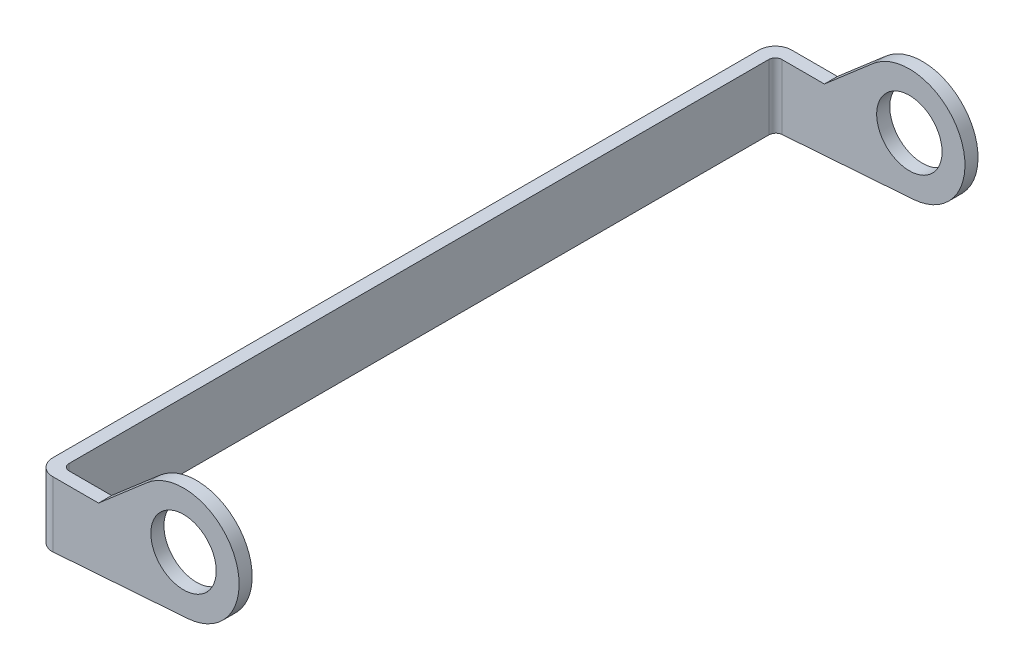
ISO-10303-21;
HEADER;
FILE_DESCRIPTION(('STEP AP214'),'2;1');
FILE_NAME('part.step','',(''),(''),'','','');
FILE_SCHEMA(('AUTOMOTIVE_DESIGN { 1 0 10303 214 1 1 1 1 }'));
ENDSEC;
DATA;
#1=APPLICATION_CONTEXT('core data for automotive mechanical design processes');
#2=APPLICATION_PROTOCOL_DEFINITION('international standard','automotive_design',2000,#1);
#3=PRODUCT_CONTEXT('',#1,'mechanical');
#4=PRODUCT('Part','Part','',(#3));
#5=PRODUCT_RELATED_PRODUCT_CATEGORY('part','',(#4));
#6=PRODUCT_DEFINITION_FORMATION('','',#4);
#7=PRODUCT_DEFINITION_CONTEXT('part definition',#1,'design');
#8=PRODUCT_DEFINITION('design','',#6,#7);
#9=PRODUCT_DEFINITION_SHAPE('','',#8);
#10=(LENGTH_UNIT() NAMED_UNIT(*) SI_UNIT(.MILLI.,.METRE.));
#11=(NAMED_UNIT(*) PLANE_ANGLE_UNIT() SI_UNIT($,.RADIAN.));
#12=(NAMED_UNIT(*) SI_UNIT($,.STERADIAN.) SOLID_ANGLE_UNIT());
#13=UNCERTAINTY_MEASURE_WITH_UNIT(LENGTH_MEASURE(1.E-05),#10,'distance_accuracy_value','');
#14=(GEOMETRIC_REPRESENTATION_CONTEXT(3) GLOBAL_UNCERTAINTY_ASSIGNED_CONTEXT((#13)) GLOBAL_UNIT_ASSIGNED_CONTEXT((#10,
#11,#12)) REPRESENTATION_CONTEXT('',''));
#15=CARTESIAN_POINT('',(0.,0.,0.));
#16=DIRECTION('',(0.,0.,1.));
#17=DIRECTION('',(1.,0.,0.));
#18=AXIS2_PLACEMENT_3D('',#15,#16,#17);
#19=CARTESIAN_POINT('',(0.,0.,4.));
#20=DIRECTION('',(0.,0.,1.));
#21=DIRECTION('',(1.,0.,0.));
#22=AXIS2_PLACEMENT_3D('',#19,#20,#21);
#23=PLANE('',#22);
#24=DIRECTION('',(-1.,0.,0.));
#25=VECTOR('',#24,1.);
#26=CARTESIAN_POINT('',(-26.,0.,3.99999999999999));
#27=LINE('',#26,#25);
#28=CARTESIAN_POINT('',(-26.,0.,3.99999999999999));
#29=VERTEX_POINT('',#28);
#30=CARTESIAN_POINT('',(-40.,0.,3.99999999999998));
#31=VERTEX_POINT('',#30);
#32=EDGE_CURVE('E223',#29,#31,#27,.T.);
#33=ORIENTED_EDGE('',*,*,#32,.T.);
#34=DIRECTION('',(0.,-1.,0.));
#35=VECTOR('',#34,1.);
#36=CARTESIAN_POINT('',(-40.,-20.,3.99999999999998));
#37=LINE('',#36,#35);
#38=CARTESIAN_POINT('',(-40.,-19.9279054285989,3.99999999999998));
#39=VERTEX_POINT('',#38);
#40=EDGE_CURVE('E297',#31,#39,#37,.T.);
#41=ORIENTED_EDGE('',*,*,#40,.T.);
#42=DIRECTION('',(0.997411273454287,0.0719079382703841,0.));
#43=VECTOR('',#42,1.);
#44=CARTESIAN_POINT('',(-41.,-20.,3.99999999999998));
#45=LINE('',#44,#43);
#46=CARTESIAN_POINT('',(1.22243495059653,-16.9559916487229,3.99999999999992));
#47=VERTEX_POINT('',#46);
#48=EDGE_CURVE('E227',#39,#47,#45,.T.);
#49=ORIENTED_EDGE('',*,*,#48,.T.);
#50=CARTESIAN_POINT('',(0.,0.,4.));
#51=DIRECTION('',(0.,0.,1.));
#52=DIRECTION('',(1.,0.,0.));
#53=AXIS2_PLACEMENT_3D('',#50,#51,#52);
#54=CIRCLE('',#53,17.);
#55=CARTESIAN_POINT('',(-11.1153846153846,12.8626678745924,4.));
#56=VERTEX_POINT('',#55);
#57=EDGE_CURVE('E231',#47,#56,#54,.T.);
#58=ORIENTED_EDGE('',*,*,#57,.T.);
#59=DIRECTION('',(-0.756627522034846,-0.653846153846154,0.));
#60=VECTOR('',#59,1.);
#61=CARTESIAN_POINT('',(-26.,0.,3.99999999999999));
#62=LINE('',#61,#60);
#63=EDGE_CURVE('E234',#56,#29,#62,.T.);
#64=ORIENTED_EDGE('',*,*,#63,.T.);
#65=EDGE_LOOP('',(#33,#41,#49,#58,#64));
#66=FACE_BOUND('',#65,.T.);
#67=CARTESIAN_POINT('',(0.,0.,4.));
#68=DIRECTION('',(0.,0.,1.));
#69=DIRECTION('',(1.,0.,0.));
#70=AXIS2_PLACEMENT_3D('',#67,#68,#69);
#71=CIRCLE('',#70,10.);
#72=CARTESIAN_POINT('',(10.,0.,4.));
#73=VERTEX_POINT('',#72);
#74=EDGE_CURVE('E215',#73,#73,#71,.T.);
#75=ORIENTED_EDGE('',*,*,#74,.F.);
#76=EDGE_LOOP('',(#75));
#77=FACE_BOUND('',#76,.T.);
#78=ADVANCED_FACE('F47',(#66,#77),#23,.T.);
#79=CARTESIAN_POINT('',(0.,0.,0.));
#80=DIRECTION('',(0.,0.,1.));
#81=DIRECTION('',(1.,0.,0.));
#82=AXIS2_PLACEMENT_3D('',#79,#80,#81);
#83=PLANE('',#82);
#84=DIRECTION('',(0.997411273454287,0.0719079382703841,0.));
#85=VECTOR('',#84,1.);
#86=CARTESIAN_POINT('',(-41.,-20.,0.));
#87=LINE('',#86,#85);
#88=CARTESIAN_POINT('',(-39.,-19.8558108571977,0.));
#89=VERTEX_POINT('',#88);
#90=CARTESIAN_POINT('',(1.22243495059653,-16.9559916487229,0.));
#91=VERTEX_POINT('',#90);
#92=EDGE_CURVE('E241',#89,#91,#87,.T.);
#93=ORIENTED_EDGE('',*,*,#92,.F.);
#94=DIRECTION('',(0.,1.,0.));
#95=VECTOR('',#94,1.);
#96=CARTESIAN_POINT('',(-39.,0.,0.));
#97=LINE('',#96,#95);
#98=CARTESIAN_POINT('',(-39.,0.,0.));
#99=VERTEX_POINT('',#98);
#100=EDGE_CURVE('E313',#89,#99,#97,.T.);
#101=ORIENTED_EDGE('',*,*,#100,.T.);
#102=DIRECTION('',(-1.,0.,0.));
#103=VECTOR('',#102,1.);
#104=CARTESIAN_POINT('',(-26.,0.,0.));
#105=LINE('',#104,#103);
#106=CARTESIAN_POINT('',(-26.,0.,0.));
#107=VERTEX_POINT('',#106);
#108=EDGE_CURVE('E219',#107,#99,#105,.T.);
#109=ORIENTED_EDGE('',*,*,#108,.F.);
#110=DIRECTION('',(-0.756627522034846,-0.653846153846154,0.));
#111=VECTOR('',#110,1.);
#112=CARTESIAN_POINT('',(-26.,0.,0.));
#113=LINE('',#112,#111);
#114=CARTESIAN_POINT('',(-11.1153846153846,12.8626678745924,0.));
#115=VERTEX_POINT('',#114);
#116=EDGE_CURVE('E228',#115,#107,#113,.T.);
#117=ORIENTED_EDGE('',*,*,#116,.F.);
#118=CARTESIAN_POINT('',(0.,0.,0.));
#119=DIRECTION('',(0.,0.,1.));
#120=DIRECTION('',(1.,0.,0.));
#121=AXIS2_PLACEMENT_3D('',#118,#119,#120);
#122=CIRCLE('',#121,17.);
#123=EDGE_CURVE('E244',#91,#115,#122,.T.);
#124=ORIENTED_EDGE('',*,*,#123,.F.);
#125=EDGE_LOOP('',(#93,#101,#109,#117,#124));
#126=FACE_BOUND('',#125,.T.);
#127=CARTESIAN_POINT('',(0.,0.,0.));
#128=DIRECTION('',(0.,0.,1.));
#129=DIRECTION('',(1.,0.,0.));
#130=AXIS2_PLACEMENT_3D('',#127,#128,#129);
#131=CIRCLE('',#130,10.);
#132=CARTESIAN_POINT('',(10.,0.,0.));
#133=VERTEX_POINT('',#132);
#134=EDGE_CURVE('E212',#133,#133,#131,.T.);
#135=ORIENTED_EDGE('',*,*,#134,.T.);
#136=EDGE_LOOP('',(#135));
#137=FACE_BOUND('',#136,.T.);
#138=ADVANCED_FACE('F345',(#126,#137),#83,.F.);
#139=CARTESIAN_POINT('',(-26.,0.,3.99999999999999));
#140=DIRECTION('',(0.,-1.,0.));
#141=DIRECTION('',(1.,0.,0.));
#142=AXIS2_PLACEMENT_3D('',#139,#140,#141);
#143=PLANE('',#142);
#144=DIRECTION('',(-1.,0.,0.));
#145=VECTOR('',#144,1.);
#146=CARTESIAN_POINT('',(-45.,0.,-222.));
#147=LINE('',#146,#145);
#148=CARTESIAN_POINT('',(-25.9999999999999,0.,-222.));
#149=VERTEX_POINT('',#148);
#150=CARTESIAN_POINT('',(-40.,0.,-222.));
#151=VERTEX_POINT('',#150);
#152=EDGE_CURVE('E173',#149,#151,#147,.T.);
#153=ORIENTED_EDGE('',*,*,#152,.T.);
#154=CARTESIAN_POINT('',(-40.,0.,-217.));
#155=DIRECTION('',(0.,-1.,0.));
#156=DIRECTION('',(1.,0.,0.));
#157=AXIS2_PLACEMENT_3D('',#154,#155,#156);
#158=CIRCLE('',#157,5.);
#159=CARTESIAN_POINT('',(-45.,0.,-217.));
#160=VERTEX_POINT('',#159);
#161=EDGE_CURVE('E294',#151,#160,#158,.F.);
#162=ORIENTED_EDGE('',*,*,#161,.T.);
#163=DIRECTION('',(0.,0.,-1.));
#164=VECTOR('',#163,1.);
#165=CARTESIAN_POINT('',(-45.,0.,3.99999999999992));
#166=LINE('',#165,#164);
#167=CARTESIAN_POINT('',(-45.,0.,-1.00000000000007));
#168=VERTEX_POINT('',#167);
#169=EDGE_CURVE('E268',#168,#160,#166,.T.);
#170=ORIENTED_EDGE('',*,*,#169,.F.);
#171=CARTESIAN_POINT('',(-40.,0.,-1.));
#172=DIRECTION('',(0.,-1.,0.));
#173=DIRECTION('',(1.,0.,0.));
#174=AXIS2_PLACEMENT_3D('',#171,#172,#173);
#175=CIRCLE('',#174,5.);
#176=EDGE_CURVE('E291',#168,#31,#175,.F.);
#177=ORIENTED_EDGE('',*,*,#176,.T.);
#178=ORIENTED_EDGE('',*,*,#32,.F.);
#179=DIRECTION('',(0.,0.,-1.));
#180=VECTOR('',#179,1.);
#181=CARTESIAN_POINT('',(-26.,0.,3.99999999999999));
#182=LINE('',#181,#180);
#183=EDGE_CURVE('E237',#29,#107,#182,.T.);
#184=ORIENTED_EDGE('',*,*,#183,.T.);
#185=ORIENTED_EDGE('',*,*,#108,.T.);
#186=CARTESIAN_POINT('',(-39.,0.,-2.));
#187=DIRECTION('',(0.,-1.,0.));
#188=DIRECTION('',(1.,0.,0.));
#189=AXIS2_PLACEMENT_3D('',#186,#187,#188);
#190=CIRCLE('',#189,2.);
#191=CARTESIAN_POINT('',(-41.,0.,-2.));
#192=VERTEX_POINT('',#191);
#193=EDGE_CURVE('E57',#99,#192,#190,.T.);
#194=ORIENTED_EDGE('',*,*,#193,.T.);
#195=DIRECTION('',(0.,0.,1.));
#196=VECTOR('',#195,1.);
#197=CARTESIAN_POINT('',(-41.,0.,-222.));
#198=LINE('',#197,#196);
#199=CARTESIAN_POINT('',(-41.,0.,-216.));
#200=VERTEX_POINT('',#199);
#201=EDGE_CURVE('E208',#200,#192,#198,.T.);
#202=ORIENTED_EDGE('',*,*,#201,.F.);
#203=CARTESIAN_POINT('',(-39.,0.,-216.));
#204=DIRECTION('',(0.,-1.,0.));
#205=DIRECTION('',(1.,0.,0.));
#206=AXIS2_PLACEMENT_3D('',#203,#204,#205);
#207=CIRCLE('',#206,2.);
#208=CARTESIAN_POINT('',(-39.,0.,-218.));
#209=VERTEX_POINT('',#208);
#210=EDGE_CURVE('E320',#200,#209,#207,.T.);
#211=ORIENTED_EDGE('',*,*,#210,.T.);
#212=DIRECTION('',(-1.,0.,0.));
#213=VECTOR('',#212,1.);
#214=CARTESIAN_POINT('',(-25.9999999999999,0.,-218.));
#215=LINE('',#214,#213);
#216=CARTESIAN_POINT('',(-25.9999999999999,0.,-218.));
#217=VERTEX_POINT('',#216);
#218=EDGE_CURVE('E163',#217,#209,#215,.T.);
#219=ORIENTED_EDGE('',*,*,#218,.F.);
#220=DIRECTION('',(0.,0.,-1.));
#221=VECTOR('',#220,1.);
#222=CARTESIAN_POINT('',(-25.9999999999999,0.,-218.));
#223=LINE('',#222,#221);
#224=EDGE_CURVE('E185',#217,#149,#223,.T.);
#225=ORIENTED_EDGE('',*,*,#224,.T.);
#226=EDGE_LOOP('',(#153,#162,#170,#177,#178,#184,#185,#194,#202,#211,#219,#225));
#227=FACE_BOUND('',#226,.T.);
#228=ADVANCED_FACE('F327',(#227),#143,.F.);
#229=CARTESIAN_POINT('',(-45.,0.,3.99999999999992));
#230=DIRECTION('',(1.,0.,0.));
#231=DIRECTION('',(0.,0.,-1.));
#232=AXIS2_PLACEMENT_3D('',#229,#230,#231);
#233=PLANE('',#232);
#234=ORIENTED_EDGE('',*,*,#169,.T.);
#235=DIRECTION('',(0.,-1.,0.));
#236=VECTOR('',#235,1.);
#237=CARTESIAN_POINT('',(-45.,0.,-217.));
#238=LINE('',#237,#236);
#239=CARTESIAN_POINT('',(-45.,-20.,-217.));
#240=VERTEX_POINT('',#239);
#241=EDGE_CURVE('E275',#160,#240,#238,.T.);
#242=ORIENTED_EDGE('',*,*,#241,.T.);
#243=DIRECTION('',(0.,0.,-1.));
#244=VECTOR('',#243,1.);
#245=CARTESIAN_POINT('',(-45.,-20.,3.99999999999992));
#246=LINE('',#245,#244);
#247=CARTESIAN_POINT('',(-45.,-20.,-1.00000000000007));
#248=VERTEX_POINT('',#247);
#249=EDGE_CURVE('E264',#248,#240,#246,.T.);
#250=ORIENTED_EDGE('',*,*,#249,.F.);
#251=DIRECTION('',(0.,-1.,0.));
#252=VECTOR('',#251,1.);
#253=CARTESIAN_POINT('',(-45.,0.,-1.00000000000007));
#254=LINE('',#253,#252);
#255=EDGE_CURVE('E272',#248,#168,#254,.F.);
#256=ORIENTED_EDGE('',*,*,#255,.T.);
#257=EDGE_LOOP('',(#234,#242,#250,#256));
#258=FACE_BOUND('',#257,.T.);
#259=ADVANCED_FACE('F369',(#258),#233,.F.);
#260=CARTESIAN_POINT('',(-45.,-20.,3.99999999999992));
#261=DIRECTION('',(0.,1.,0.));
#262=DIRECTION('',(0.,0.,1.));
#263=AXIS2_PLACEMENT_3D('',#260,#261,#262);
#264=PLANE('',#263);
#265=ORIENTED_EDGE('',*,*,#249,.T.);
#266=CARTESIAN_POINT('',(-40.,-20.,-217.));
#267=DIRECTION('',(0.,1.,0.));
#268=DIRECTION('',(0.,0.,1.));
#269=AXIS2_PLACEMENT_3D('',#266,#267,#268);
#270=CIRCLE('',#269,5.);
#271=CARTESIAN_POINT('',(-41.,-20.,-221.898979485566));
#272=VERTEX_POINT('',#271);
#273=EDGE_CURVE('E282',#240,#272,#270,.F.);
#274=ORIENTED_EDGE('',*,*,#273,.T.);
#275=DIRECTION('',(0.,0.,1.));
#276=VECTOR('',#275,1.);
#277=CARTESIAN_POINT('',(-41.,-20.,-222.));
#278=LINE('',#277,#276);
#279=CARTESIAN_POINT('',(-41.,-20.,-216.));
#280=VERTEX_POINT('',#279);
#281=EDGE_CURVE('E64',#272,#280,#278,.T.);
#282=ORIENTED_EDGE('',*,*,#281,.T.);
#283=CARTESIAN_POINT('',(-41.,-20.,-2.));
#284=VERTEX_POINT('',#283);
#285=EDGE_CURVE('E207',#280,#284,#278,.T.);
#286=ORIENTED_EDGE('',*,*,#285,.T.);
#287=DIRECTION('',(0.,0.,-1.));
#288=VECTOR('',#287,1.);
#289=CARTESIAN_POINT('',(-41.,-20.,3.99999999999998));
#290=LINE('',#289,#288);
#291=CARTESIAN_POINT('',(-41.,-20.,3.89897948556633));
#292=VERTEX_POINT('',#291);
#293=EDGE_CURVE('E260',#292,#284,#290,.T.);
#294=ORIENTED_EDGE('',*,*,#293,.F.);
#295=CARTESIAN_POINT('',(-40.,-20.,-1.));
#296=DIRECTION('',(0.,1.,0.));
#297=DIRECTION('',(0.,0.,1.));
#298=AXIS2_PLACEMENT_3D('',#295,#296,#297);
#299=CIRCLE('',#298,5.);
#300=EDGE_CURVE('E279',#292,#248,#299,.F.);
#301=ORIENTED_EDGE('',*,*,#300,.T.);
#302=EDGE_LOOP('',(#265,#274,#282,#286,#294,#301));
#303=FACE_BOUND('',#302,.T.);
#304=ADVANCED_FACE('F362',(#303),#264,.F.);
#305=CARTESIAN_POINT('',(-41.,-20.,3.99999999999998));
#306=DIRECTION('',(-0.0719079382703841,0.997411273454287,0.));
#307=DIRECTION('',(-0.997411273454287,-0.0719079382703841,0.));
#308=AXIS2_PLACEMENT_3D('',#305,#306,#307);
#309=PLANE('',#308);
#310=ORIENTED_EDGE('',*,*,#48,.F.);
#311=CARTESIAN_POINT('',(-40.,-19.9279054285989,-1.));
#312=DIRECTION('',(-0.0719079382703841,0.997411273454287,0.));
#313=DIRECTION('',(0.997411273454287,0.0719079382703841,0.));
#314=AXIS2_PLACEMENT_3D('',#311,#312,#313);
#315=ELLIPSE('',#314,5.01297722722116,5.);
#316=EDGE_CURVE('E301',#39,#292,#315,.F.);
#317=ORIENTED_EDGE('',*,*,#316,.T.);
#318=ORIENTED_EDGE('',*,*,#293,.T.);
#319=CARTESIAN_POINT('',(-39.,-19.8558108571977,-2.));
#320=DIRECTION('',(-0.0719079382703841,0.997411273454287,0.));
#321=DIRECTION('',(0.997411273454287,0.0719079382703841,0.));
#322=AXIS2_PLACEMENT_3D('',#319,#320,#321);
#323=ELLIPSE('',#322,2.00519089088846,2.);
#324=EDGE_CURVE('E11',#284,#89,#323,.T.);
#325=ORIENTED_EDGE('',*,*,#324,.T.);
#326=ORIENTED_EDGE('',*,*,#92,.T.);
#327=DIRECTION('',(0.,0.,-1.));
#328=VECTOR('',#327,1.);
#329=CARTESIAN_POINT('',(1.22243495059653,-16.9559916487229,3.99999999999992));
#330=LINE('',#329,#328);
#331=EDGE_CURVE('E256',#47,#91,#330,.T.);
#332=ORIENTED_EDGE('',*,*,#331,.F.);
#333=EDGE_LOOP('',(#310,#317,#318,#325,#326,#332));
#334=FACE_BOUND('',#333,.T.);
#335=ADVANCED_FACE('F340',(#334),#309,.F.);
#336=CARTESIAN_POINT('',(0.,0.,4.));
#337=DIRECTION('',(0.,0.,-1.));
#338=DIRECTION('',(-1.,0.,0.));
#339=AXIS2_PLACEMENT_3D('',#336,#337,#338);
#340=CYLINDRICAL_SURFACE('',#339,17.);
#341=ORIENTED_EDGE('',*,*,#123,.T.);
#342=DIRECTION('',(0.,0.,-1.));
#343=VECTOR('',#342,1.);
#344=CARTESIAN_POINT('',(-11.1153846153846,12.8626678745924,4.));
#345=LINE('',#344,#343);
#346=EDGE_CURVE('E252',#56,#115,#345,.T.);
#347=ORIENTED_EDGE('',*,*,#346,.F.);
#348=ORIENTED_EDGE('',*,*,#57,.F.);
#349=ORIENTED_EDGE('',*,*,#331,.T.);
#350=EDGE_LOOP('',(#341,#347,#348,#349));
#351=FACE_BOUND('',#350,.T.);
#352=ADVANCED_FACE('F350',(#351),#340,.T.);
#353=CARTESIAN_POINT('',(-26.,0.,3.99999999999999));
#354=DIRECTION('',(0.653846153846154,-0.756627522034846,0.));
#355=DIRECTION('',(0.756627522034846,0.653846153846154,0.));
#356=AXIS2_PLACEMENT_3D('',#353,#354,#355);
#357=PLANE('',#356);
#358=ORIENTED_EDGE('',*,*,#116,.T.);
#359=ORIENTED_EDGE('',*,*,#183,.F.);
#360=ORIENTED_EDGE('',*,*,#63,.F.);
#361=ORIENTED_EDGE('',*,*,#346,.T.);
#362=EDGE_LOOP('',(#358,#359,#360,#361));
#363=FACE_BOUND('',#362,.T.);
#364=ADVANCED_FACE('F354',(#363),#357,.F.);
#365=CARTESIAN_POINT('',(0.,0.,4.));
#366=DIRECTION('',(0.,0.,-1.));
#367=DIRECTION('',(-1.,0.,0.));
#368=AXIS2_PLACEMENT_3D('',#365,#366,#367);
#369=CYLINDRICAL_SURFACE('',#368,10.);
#370=ORIENTED_EDGE('',*,*,#74,.T.);
#371=EDGE_LOOP('',(#370));
#372=FACE_BOUND('',#371,.T.);
#373=ORIENTED_EDGE('',*,*,#134,.F.);
#374=EDGE_LOOP('',(#373));
#375=FACE_BOUND('',#374,.T.);
#376=ADVANCED_FACE('F415',(#372,#375),#369,.F.);
#377=CARTESIAN_POINT('',(-41.,0.,-222.));
#378=DIRECTION('',(1.,0.,0.));
#379=DIRECTION('',(0.,1.,0.));
#380=AXIS2_PLACEMENT_3D('',#377,#378,#379);
#381=PLANE('',#380);
#382=ORIENTED_EDGE('',*,*,#285,.F.);
#383=DIRECTION('',(0.,-1.,0.));
#384=VECTOR('',#383,1.);
#385=CARTESIAN_POINT('',(-41.,0.,-216.));
#386=LINE('',#385,#384);
#387=EDGE_CURVE('E310',#280,#200,#386,.F.);
#388=ORIENTED_EDGE('',*,*,#387,.T.);
#389=ORIENTED_EDGE('',*,*,#201,.T.);
#390=DIRECTION('',(0.,1.,0.));
#391=VECTOR('',#390,1.);
#392=CARTESIAN_POINT('',(-41.,0.,-2.));
#393=LINE('',#392,#391);
#394=EDGE_CURVE('E306',#192,#284,#393,.F.);
#395=ORIENTED_EDGE('',*,*,#394,.T.);
#396=EDGE_LOOP('',(#382,#388,#389,#395));
#397=FACE_BOUND('',#396,.T.);
#398=ADVANCED_FACE('F334',(#397),#381,.T.);
#399=CARTESIAN_POINT('',(-45.,-20.,-222.));
#400=DIRECTION('',(0.,0.,1.));
#401=DIRECTION('',(1.,0.,0.));
#402=AXIS2_PLACEMENT_3D('',#399,#400,#401);
#403=PLANE('',#402);
#404=DIRECTION('',(0.997411273454287,0.0719079382703841,0.));
#405=VECTOR('',#404,1.);
#406=CARTESIAN_POINT('',(-41.,-20.,-222.));
#407=LINE('',#406,#405);
#408=CARTESIAN_POINT('',(-40.,-19.9279054285989,-222.));
#409=VERTEX_POINT('',#408);
#410=CARTESIAN_POINT('',(1.2224349505966,-16.9559916487229,-222.));
#411=VERTEX_POINT('',#410);
#412=EDGE_CURVE('E169',#409,#411,#407,.T.);
#413=ORIENTED_EDGE('',*,*,#412,.F.);
#414=DIRECTION('',(0.,-1.,0.));
#415=VECTOR('',#414,1.);
#416=CARTESIAN_POINT('',(-40.,-20.,-222.));
#417=LINE('',#416,#415);
#418=EDGE_CURVE('E288',#409,#151,#417,.F.);
#419=ORIENTED_EDGE('',*,*,#418,.T.);
#420=ORIENTED_EDGE('',*,*,#152,.F.);
#421=DIRECTION('',(-0.756627522034846,-0.653846153846154,0.));
#422=VECTOR('',#421,1.);
#423=CARTESIAN_POINT('',(-25.9999999999999,0.,-222.));
#424=LINE('',#423,#422);
#425=CARTESIAN_POINT('',(-11.1153846153845,12.8626678745924,-222.));
#426=VERTEX_POINT('',#425);
#427=EDGE_CURVE('E195',#426,#149,#424,.T.);
#428=ORIENTED_EDGE('',*,*,#427,.F.);
#429=CARTESIAN_POINT('',(0.,0.,-222.));
#430=DIRECTION('',(0.,0.,1.));
#431=DIRECTION('',(1.,0.,0.));
#432=AXIS2_PLACEMENT_3D('',#429,#430,#431);
#433=CIRCLE('',#432,17.);
#434=EDGE_CURVE('E191',#411,#426,#433,.T.);
#435=ORIENTED_EDGE('',*,*,#434,.F.);
#436=EDGE_LOOP('',(#413,#419,#420,#428,#435));
#437=FACE_BOUND('',#436,.T.);
#438=CARTESIAN_POINT('',(0.,0.,-222.));
#439=DIRECTION('',(0.,0.,1.));
#440=DIRECTION('',(1.,0.,0.));
#441=AXIS2_PLACEMENT_3D('',#438,#439,#440);
#442=CIRCLE('',#441,10.);
#443=CARTESIAN_POINT('',(10.0000000000001,0.,-222.));
#444=VERTEX_POINT('',#443);
#445=EDGE_CURVE('E384',#444,#444,#442,.T.);
#446=ORIENTED_EDGE('',*,*,#445,.T.);
#447=EDGE_LOOP('',(#446));
#448=FACE_BOUND('',#447,.T.);
#449=ADVANCED_FACE('F397',(#437,#448),#403,.F.);
#450=CARTESIAN_POINT('',(0.,0.,-218.));
#451=DIRECTION('',(0.,0.,1.));
#452=DIRECTION('',(1.,0.,0.));
#453=AXIS2_PLACEMENT_3D('',#450,#451,#452);
#454=PLANE('',#453);
#455=ORIENTED_EDGE('',*,*,#218,.T.);
#456=DIRECTION('',(0.,-1.,0.));
#457=VECTOR('',#456,1.);
#458=CARTESIAN_POINT('',(-39.,-20.,-218.));
#459=LINE('',#458,#457);
#460=CARTESIAN_POINT('',(-39.,-19.8558108571977,-218.));
#461=VERTEX_POINT('',#460);
#462=EDGE_CURVE('E159',#209,#461,#459,.T.);
#463=ORIENTED_EDGE('',*,*,#462,.T.);
#464=DIRECTION('',(0.997411273454287,0.0719079382703841,0.));
#465=VECTOR('',#464,1.);
#466=CARTESIAN_POINT('',(-41.,-20.,-218.));
#467=LINE('',#466,#465);
#468=CARTESIAN_POINT('',(1.2224349505966,-16.9559916487229,-218.));
#469=VERTEX_POINT('',#468);
#470=EDGE_CURVE('E150',#461,#469,#467,.T.);
#471=ORIENTED_EDGE('',*,*,#470,.T.);
#472=CARTESIAN_POINT('',(0.,0.,-218.));
#473=DIRECTION('',(0.,0.,1.));
#474=DIRECTION('',(1.,0.,0.));
#475=AXIS2_PLACEMENT_3D('',#472,#473,#474);
#476=CIRCLE('',#475,17.);
#477=CARTESIAN_POINT('',(-11.1153846153846,12.8626678745924,-218.));
#478=VERTEX_POINT('',#477);
#479=EDGE_CURVE('E156',#469,#478,#476,.T.);
#480=ORIENTED_EDGE('',*,*,#479,.T.);
#481=DIRECTION('',(-0.756627522034846,-0.653846153846154,0.));
#482=VECTOR('',#481,1.);
#483=CARTESIAN_POINT('',(-25.9999999999999,0.,-218.));
#484=LINE('',#483,#482);
#485=EDGE_CURVE('E180',#478,#217,#484,.T.);
#486=ORIENTED_EDGE('',*,*,#485,.T.);
#487=EDGE_LOOP('',(#455,#463,#471,#480,#486));
#488=FACE_BOUND('',#487,.T.);
#489=CARTESIAN_POINT('',(0.,0.,-218.));
#490=DIRECTION('',(0.,0.,1.));
#491=DIRECTION('',(1.,0.,0.));
#492=AXIS2_PLACEMENT_3D('',#489,#490,#491);
#493=CIRCLE('',#492,10.);
#494=CARTESIAN_POINT('',(10.0000000000001,0.,-218.));
#495=VERTEX_POINT('',#494);
#496=EDGE_CURVE('E192',#495,#495,#493,.T.);
#497=ORIENTED_EDGE('',*,*,#496,.F.);
#498=EDGE_LOOP('',(#497));
#499=FACE_BOUND('',#498,.T.);
#500=ADVANCED_FACE('F153',(#488,#499),#454,.T.);
#501=CARTESIAN_POINT('',(-41.,-20.,-218.));
#502=DIRECTION('',(-0.0719079382703841,0.997411273454287,0.));
#503=DIRECTION('',(-0.997411273454287,-0.0719079382703841,0.));
#504=AXIS2_PLACEMENT_3D('',#501,#502,#503);
#505=PLANE('',#504);
#506=ORIENTED_EDGE('',*,*,#281,.F.);
#507=CARTESIAN_POINT('',(-40.,-19.9279054285989,-217.));
#508=DIRECTION('',(-0.0719079382703841,0.997411273454287,0.));
#509=DIRECTION('',(-0.997411273454287,-0.0719079382703841,0.));
#510=AXIS2_PLACEMENT_3D('',#507,#508,#509);
#511=ELLIPSE('',#510,5.01297722722116,5.);
#512=EDGE_CURVE('E285',#272,#409,#511,.F.);
#513=ORIENTED_EDGE('',*,*,#512,.T.);
#514=ORIENTED_EDGE('',*,*,#412,.T.);
#515=DIRECTION('',(0.,0.,-1.));
#516=VECTOR('',#515,1.);
#517=CARTESIAN_POINT('',(1.2224349505966,-16.9559916487229,-218.));
#518=LINE('',#517,#516);
#519=EDGE_CURVE('E166',#469,#411,#518,.T.);
#520=ORIENTED_EDGE('',*,*,#519,.F.);
#521=ORIENTED_EDGE('',*,*,#470,.F.);
#522=CARTESIAN_POINT('',(-39.,-19.8558108571977,-216.));
#523=DIRECTION('',(-0.0719079382703841,0.997411273454287,0.));
#524=DIRECTION('',(0.997411273454287,0.0719079382703841,0.));
#525=AXIS2_PLACEMENT_3D('',#522,#523,#524);
#526=ELLIPSE('',#525,2.00519089088846,2.);
#527=EDGE_CURVE('E317',#461,#280,#526,.T.);
#528=ORIENTED_EDGE('',*,*,#527,.T.);
#529=EDGE_LOOP('',(#506,#513,#514,#520,#521,#528));
#530=FACE_BOUND('',#529,.T.);
#531=ADVANCED_FACE('F167',(#530),#505,.F.);
#532=CARTESIAN_POINT('',(0.,0.,-218.));
#533=DIRECTION('',(0.,0.,-1.));
#534=DIRECTION('',(-1.,0.,0.));
#535=AXIS2_PLACEMENT_3D('',#532,#533,#534);
#536=CYLINDRICAL_SURFACE('',#535,17.);
#537=ORIENTED_EDGE('',*,*,#434,.T.);
#538=DIRECTION('',(0.,0.,-1.));
#539=VECTOR('',#538,1.);
#540=CARTESIAN_POINT('',(-11.1153846153846,12.8626678745924,-218.));
#541=LINE('',#540,#539);
#542=EDGE_CURVE('E174',#478,#426,#541,.T.);
#543=ORIENTED_EDGE('',*,*,#542,.F.);
#544=ORIENTED_EDGE('',*,*,#479,.F.);
#545=ORIENTED_EDGE('',*,*,#519,.T.);
#546=EDGE_LOOP('',(#537,#543,#544,#545));
#547=FACE_BOUND('',#546,.T.);
#548=ADVANCED_FACE('F176',(#547),#536,.T.);
#549=CARTESIAN_POINT('',(-25.9999999999999,0.,-218.));
#550=DIRECTION('',(0.653846153846154,-0.756627522034846,0.));
#551=DIRECTION('',(0.756627522034846,0.653846153846154,0.));
#552=AXIS2_PLACEMENT_3D('',#549,#550,#551);
#553=PLANE('',#552);
#554=ORIENTED_EDGE('',*,*,#427,.T.);
#555=ORIENTED_EDGE('',*,*,#224,.F.);
#556=ORIENTED_EDGE('',*,*,#485,.F.);
#557=ORIENTED_EDGE('',*,*,#542,.T.);
#558=EDGE_LOOP('',(#554,#555,#556,#557));
#559=FACE_BOUND('',#558,.T.);
#560=ADVANCED_FACE('F459',(#559),#553,.F.);
#561=CARTESIAN_POINT('',(0.,0.,-218.));
#562=DIRECTION('',(0.,0.,-1.));
#563=DIRECTION('',(-1.,0.,0.));
#564=AXIS2_PLACEMENT_3D('',#561,#562,#563);
#565=CYLINDRICAL_SURFACE('',#564,10.);
#566=ORIENTED_EDGE('',*,*,#496,.T.);
#567=EDGE_LOOP('',(#566));
#568=FACE_BOUND('',#567,.T.);
#569=ORIENTED_EDGE('',*,*,#445,.F.);
#570=EDGE_LOOP('',(#569));
#571=FACE_BOUND('',#570,.T.);
#572=ADVANCED_FACE('F394',(#568,#571),#565,.F.);
#573=CARTESIAN_POINT('',(-40.,0.,-217.));
#574=DIRECTION('',(0.,-1.,0.));
#575=DIRECTION('',(0.,0.,-1.));
#576=AXIS2_PLACEMENT_3D('',#573,#574,#575);
#577=CYLINDRICAL_SURFACE('',#576,5.);
#578=ORIENTED_EDGE('',*,*,#161,.F.);
#579=ORIENTED_EDGE('',*,*,#418,.F.);
#580=ORIENTED_EDGE('',*,*,#512,.F.);
#581=ORIENTED_EDGE('',*,*,#273,.F.);
#582=ORIENTED_EDGE('',*,*,#241,.F.);
#583=EDGE_LOOP('',(#578,#579,#580,#581,#582));
#584=FACE_BOUND('',#583,.T.);
#585=ADVANCED_FACE('F374',(#584),#577,.T.);
#586=CARTESIAN_POINT('',(-40.,0.,-1.));
#587=DIRECTION('',(0.,1.,0.));
#588=DIRECTION('',(0.,0.,1.));
#589=AXIS2_PLACEMENT_3D('',#586,#587,#588);
#590=CYLINDRICAL_SURFACE('',#589,5.);
#591=ORIENTED_EDGE('',*,*,#176,.F.);
#592=ORIENTED_EDGE('',*,*,#255,.F.);
#593=ORIENTED_EDGE('',*,*,#300,.F.);
#594=ORIENTED_EDGE('',*,*,#316,.F.);
#595=ORIENTED_EDGE('',*,*,#40,.F.);
#596=EDGE_LOOP('',(#591,#592,#593,#594,#595));
#597=FACE_BOUND('',#596,.T.);
#598=ADVANCED_FACE('F366',(#597),#590,.T.);
#599=CARTESIAN_POINT('',(-39.,0.,-216.));
#600=DIRECTION('',(0.,1.,0.));
#601=DIRECTION('',(-1.,0.,0.));
#602=AXIS2_PLACEMENT_3D('',#599,#600,#601);
#603=CYLINDRICAL_SURFACE('',#602,2.);
#604=ORIENTED_EDGE('',*,*,#210,.F.);
#605=ORIENTED_EDGE('',*,*,#387,.F.);
#606=ORIENTED_EDGE('',*,*,#527,.F.);
#607=ORIENTED_EDGE('',*,*,#462,.F.);
#608=EDGE_LOOP('',(#604,#605,#606,#607));
#609=FACE_BOUND('',#608,.T.);
#610=ADVANCED_FACE('F377',(#609),#603,.F.);
#611=CARTESIAN_POINT('',(-39.,0.,-2.));
#612=DIRECTION('',(0.,1.,0.));
#613=DIRECTION('',(-1.,0.,0.));
#614=AXIS2_PLACEMENT_3D('',#611,#612,#613);
#615=CYLINDRICAL_SURFACE('',#614,2.);
#616=ORIENTED_EDGE('',*,*,#324,.F.);
#617=ORIENTED_EDGE('',*,*,#394,.F.);
#618=ORIENTED_EDGE('',*,*,#193,.F.);
#619=ORIENTED_EDGE('',*,*,#100,.F.);
#620=EDGE_LOOP('',(#616,#617,#618,#619));
#621=FACE_BOUND('',#620,.T.);
#622=ADVANCED_FACE('F49',(#621),#615,.F.);
#623=CLOSED_SHELL('',(#78,#138,#228,#259,#304,#335,#352,#364,#376,#398,#449,#500,#531,#548,#560,
#572,#585,#598,#610,#622));
#624=MANIFOLD_SOLID_BREP('B2',#623);
#625=ADVANCED_BREP_SHAPE_REPRESENTATION('',(#18,#624),#14);
#626=SHAPE_DEFINITION_REPRESENTATION(#9,#625);
ENDSEC;
END-ISO-10303-21;
